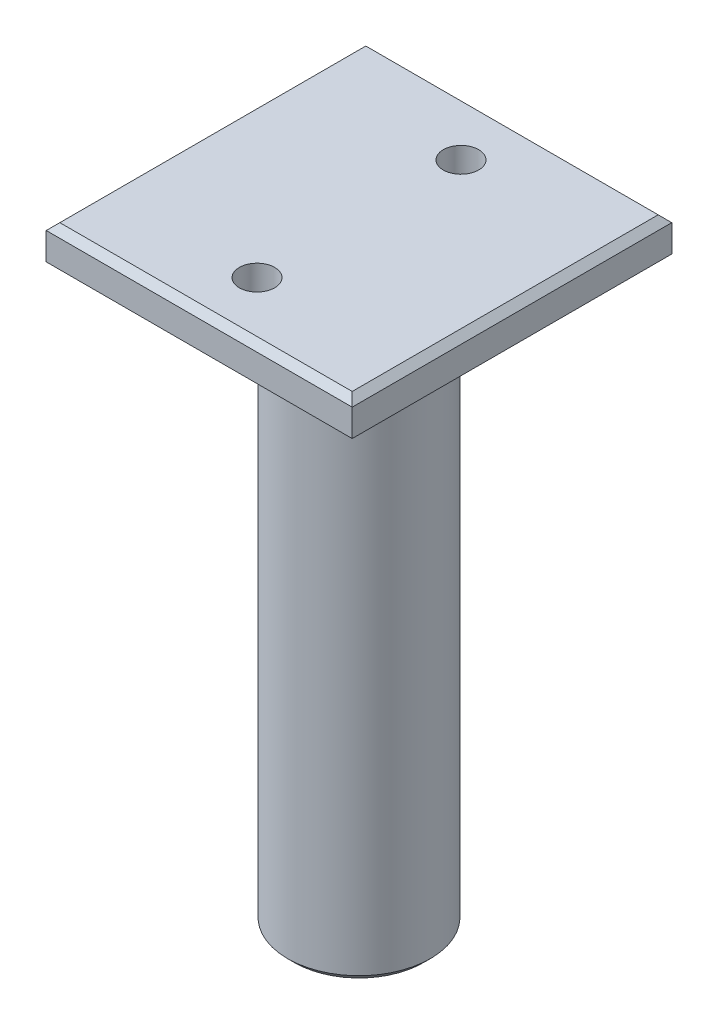
ISO-10303-21;
HEADER;
FILE_DESCRIPTION(('STEP AP214'),'2;1');
FILE_NAME('part.step','',(''),(''),'','','');
FILE_SCHEMA(('AUTOMOTIVE_DESIGN { 1 0 10303 214 1 1 1 1 }'));
ENDSEC;
DATA;
#1=APPLICATION_CONTEXT('core data for automotive mechanical design processes');
#2=APPLICATION_PROTOCOL_DEFINITION('international standard','automotive_design',2000,#1);
#3=PRODUCT_CONTEXT('',#1,'mechanical');
#4=PRODUCT('Part','Part','',(#3));
#5=PRODUCT_RELATED_PRODUCT_CATEGORY('part','',(#4));
#6=PRODUCT_DEFINITION_FORMATION('','',#4);
#7=PRODUCT_DEFINITION_CONTEXT('part definition',#1,'design');
#8=PRODUCT_DEFINITION('design','',#6,#7);
#9=PRODUCT_DEFINITION_SHAPE('','',#8);
#10=(LENGTH_UNIT() NAMED_UNIT(*) SI_UNIT(.MILLI.,.METRE.));
#11=(NAMED_UNIT(*) PLANE_ANGLE_UNIT() SI_UNIT($,.RADIAN.));
#12=(NAMED_UNIT(*) SI_UNIT($,.STERADIAN.) SOLID_ANGLE_UNIT());
#13=UNCERTAINTY_MEASURE_WITH_UNIT(LENGTH_MEASURE(1.E-05),#10,'distance_accuracy_value','');
#14=(GEOMETRIC_REPRESENTATION_CONTEXT(3) GLOBAL_UNCERTAINTY_ASSIGNED_CONTEXT((#13)) GLOBAL_UNIT_ASSIGNED_CONTEXT((#10,
#11,#12)) REPRESENTATION_CONTEXT('',''));
#15=CARTESIAN_POINT('',(0.,0.,0.));
#16=DIRECTION('',(0.,0.,1.));
#17=DIRECTION('',(1.,0.,0.));
#18=AXIS2_PLACEMENT_3D('',#15,#16,#17);
#19=CARTESIAN_POINT('',(0.,0.,0.));
#20=DIRECTION('',(0.,-1.,0.));
#21=DIRECTION('',(0.,0.,-1.));
#22=AXIS2_PLACEMENT_3D('',#19,#20,#21);
#23=PLANE('',#22);
#24=CARTESIAN_POINT('',(0.,0.,15.));
#25=DIRECTION('',(0.,1.,0.));
#26=DIRECTION('',(0.,0.,1.));
#27=AXIS2_PLACEMENT_3D('',#24,#25,#26);
#28=CIRCLE('',#27,2.6);
#29=CARTESIAN_POINT('',(0.,0.,17.6));
#30=VERTEX_POINT('',#29);
#31=EDGE_CURVE('E145',#30,#30,#28,.T.);
#32=ORIENTED_EDGE('',*,*,#31,.F.);
#33=EDGE_LOOP('',(#32));
#34=FACE_BOUND('',#33,.T.);
#35=CARTESIAN_POINT('',(0.,0.,-15.));
#36=DIRECTION('',(0.,1.,0.));
#37=DIRECTION('',(0.,0.,1.));
#38=AXIS2_PLACEMENT_3D('',#35,#36,#37);
#39=CIRCLE('',#38,2.6);
#40=CARTESIAN_POINT('',(0.,0.,-12.4));
#41=VERTEX_POINT('',#40);
#42=EDGE_CURVE('E343',#41,#41,#39,.T.);
#43=ORIENTED_EDGE('',*,*,#42,.F.);
#44=EDGE_LOOP('',(#43));
#45=FACE_BOUND('',#44,.T.);
#46=DIRECTION('',(0.,0.,-1.));
#47=VECTOR('',#46,1.);
#48=CARTESIAN_POINT('',(21.5,0.,0.));
#49=LINE('',#48,#47);
#50=CARTESIAN_POINT('',(21.5,0.,22.5));
#51=VERTEX_POINT('',#50);
#52=CARTESIAN_POINT('',(21.5,0.,-22.5));
#53=VERTEX_POINT('',#52);
#54=EDGE_CURVE('E130',#51,#53,#49,.T.);
#55=ORIENTED_EDGE('',*,*,#54,.T.);
#56=DIRECTION('',(-1.,0.,0.));
#57=VECTOR('',#56,1.);
#58=CARTESIAN_POINT('',(-22.5,0.,-22.5));
#59=LINE('',#58,#57);
#60=CARTESIAN_POINT('',(-21.5,0.,-22.5));
#61=VERTEX_POINT('',#60);
#62=EDGE_CURVE('E135',#53,#61,#59,.T.);
#63=ORIENTED_EDGE('',*,*,#62,.T.);
#64=DIRECTION('',(0.,0.,1.));
#65=VECTOR('',#64,1.);
#66=CARTESIAN_POINT('',(-21.5,0.,23.5));
#67=LINE('',#66,#65);
#68=CARTESIAN_POINT('',(-21.5,0.,22.5));
#69=VERTEX_POINT('',#68);
#70=EDGE_CURVE('E133',#61,#69,#67,.T.);
#71=ORIENTED_EDGE('',*,*,#70,.T.);
#72=DIRECTION('',(1.,0.,0.));
#73=VECTOR('',#72,1.);
#74=CARTESIAN_POINT('',(0.,0.,22.5));
#75=LINE('',#74,#73);
#76=EDGE_CURVE('E128',#69,#51,#75,.T.);
#77=ORIENTED_EDGE('',*,*,#76,.T.);
#78=EDGE_LOOP('',(#55,#63,#71,#77));
#79=FACE_BOUND('',#78,.T.);
#80=ADVANCED_FACE('F40',(#34,#45,#79),#23,.F.);
#81=CARTESIAN_POINT('',(0.,-90.,0.));
#82=DIRECTION('',(0.,1.,0.));
#83=DIRECTION('',(0.,0.,1.));
#84=AXIS2_PLACEMENT_3D('',#81,#82,#83);
#85=PLANE('',#84);
#86=CARTESIAN_POINT('',(0.,-90.,0.));
#87=DIRECTION('',(0.,-1.,0.));
#88=DIRECTION('',(0.,0.,-1.));
#89=AXIS2_PLACEMENT_3D('',#86,#87,#88);
#90=CIRCLE('',#89,4.59999999999999);
#91=CARTESIAN_POINT('',(0.,-90.,-4.59999999999999));
#92=VERTEX_POINT('',#91);
#93=EDGE_CURVE('E125',#92,#92,#90,.T.);
#94=ORIENTED_EDGE('',*,*,#93,.F.);
#95=EDGE_LOOP('',(#94));
#96=FACE_BOUND('',#95,.T.);
#97=CARTESIAN_POINT('',(0.,-90.,0.));
#98=DIRECTION('',(0.,1.,0.));
#99=DIRECTION('',(0.,0.,1.));
#100=AXIS2_PLACEMENT_3D('',#97,#98,#99);
#101=CIRCLE('',#100,9.49999999999999);
#102=CARTESIAN_POINT('',(0.,-90.,9.49999999999999));
#103=VERTEX_POINT('',#102);
#104=EDGE_CURVE('E131',#103,#103,#101,.F.);
#105=ORIENTED_EDGE('',*,*,#104,.T.);
#106=EDGE_LOOP('',(#105));
#107=FACE_BOUND('',#106,.T.);
#108=ADVANCED_FACE('F181',(#96,#107),#85,.F.);
#109=CARTESIAN_POINT('',(0.,-5.,0.));
#110=DIRECTION('',(0.,-1.,0.));
#111=DIRECTION('',(0.,0.,-1.));
#112=AXIS2_PLACEMENT_3D('',#109,#110,#111);
#113=PLANE('',#112);
#114=CARTESIAN_POINT('',(0.,-5.,15.));
#115=DIRECTION('',(0.,-1.,0.));
#116=DIRECTION('',(0.,0.,-1.));
#117=AXIS2_PLACEMENT_3D('',#114,#115,#116);
#118=CIRCLE('',#117,2.6);
#119=CARTESIAN_POINT('',(0.,-4.99999999999999,17.6));
#120=VERTEX_POINT('',#119);
#121=EDGE_CURVE('E340',#120,#120,#118,.F.);
#122=ORIENTED_EDGE('',*,*,#121,.T.);
#123=EDGE_LOOP('',(#122));
#124=FACE_BOUND('',#123,.T.);
#125=CARTESIAN_POINT('',(0.,-5.,-15.));
#126=DIRECTION('',(0.,-1.,0.));
#127=DIRECTION('',(0.,0.,-1.));
#128=AXIS2_PLACEMENT_3D('',#125,#126,#127);
#129=CIRCLE('',#128,2.6);
#130=CARTESIAN_POINT('',(0.,-4.99999999999999,-12.4));
#131=VERTEX_POINT('',#130);
#132=EDGE_CURVE('E347',#131,#131,#129,.F.);
#133=ORIENTED_EDGE('',*,*,#132,.T.);
#134=EDGE_LOOP('',(#133));
#135=FACE_BOUND('',#134,.T.);
#136=DIRECTION('',(-1.,0.,0.));
#137=VECTOR('',#136,1.);
#138=CARTESIAN_POINT('',(22.5,-5.,-23.5));
#139=LINE('',#138,#137);
#140=CARTESIAN_POINT('',(22.5,-5.,-23.5));
#141=VERTEX_POINT('',#140);
#142=CARTESIAN_POINT('',(-22.5,-5.,-23.5));
#143=VERTEX_POINT('',#142);
#144=EDGE_CURVE('E99',#141,#143,#139,.T.);
#145=ORIENTED_EDGE('',*,*,#144,.F.);
#146=DIRECTION('',(0.,0.,1.));
#147=VECTOR('',#146,1.);
#148=CARTESIAN_POINT('',(22.5,-5.,-28.5));
#149=LINE('',#148,#147);
#150=CARTESIAN_POINT('',(22.5,-5.,23.5));
#151=VERTEX_POINT('',#150);
#152=EDGE_CURVE('E120',#141,#151,#149,.T.);
#153=ORIENTED_EDGE('',*,*,#152,.T.);
#154=DIRECTION('',(-1.,0.,0.));
#155=VECTOR('',#154,1.);
#156=CARTESIAN_POINT('',(22.5,-5.,23.5));
#157=LINE('',#156,#155);
#158=CARTESIAN_POINT('',(-22.5,-5.,23.5));
#159=VERTEX_POINT('',#158);
#160=EDGE_CURVE('E101',#151,#159,#157,.T.);
#161=ORIENTED_EDGE('',*,*,#160,.T.);
#162=DIRECTION('',(0.,0.,1.));
#163=VECTOR('',#162,1.);
#164=CARTESIAN_POINT('',(-22.5,-5.,-28.5));
#165=LINE('',#164,#163);
#166=EDGE_CURVE('E95',#143,#159,#165,.T.);
#167=ORIENTED_EDGE('',*,*,#166,.F.);
#168=EDGE_LOOP('',(#145,#153,#161,#167));
#169=FACE_BOUND('',#168,.T.);
#170=CARTESIAN_POINT('',(0.,-5.,0.));
#171=DIRECTION('',(0.,1.,0.));
#172=DIRECTION('',(0.,0.,1.));
#173=AXIS2_PLACEMENT_3D('',#170,#171,#172);
#174=CIRCLE('',#173,10.5);
#175=CARTESIAN_POINT('',(0.,-5.,10.5));
#176=VERTEX_POINT('',#175);
#177=EDGE_CURVE('E173',#176,#176,#174,.F.);
#178=ORIENTED_EDGE('',*,*,#177,.F.);
#179=EDGE_LOOP('',(#178));
#180=FACE_BOUND('',#179,.T.);
#181=ADVANCED_FACE('F97',(#124,#135,#169,#180),#113,.T.);
#182=CARTESIAN_POINT('',(0.,-90.,0.));
#183=DIRECTION('',(0.,1.,0.));
#184=DIRECTION('',(0.,0.,1.));
#185=AXIS2_PLACEMENT_3D('',#182,#183,#184);
#186=CYLINDRICAL_SURFACE('',#185,10.5);
#187=CARTESIAN_POINT('',(0.,-89.,0.));
#188=DIRECTION('',(0.,1.,0.));
#189=DIRECTION('',(0.,0.,1.));
#190=AXIS2_PLACEMENT_3D('',#187,#188,#189);
#191=CIRCLE('',#190,10.5);
#192=CARTESIAN_POINT('',(0.,-89.,10.5));
#193=VERTEX_POINT('',#192);
#194=EDGE_CURVE('E176',#193,#193,#191,.T.);
#195=ORIENTED_EDGE('',*,*,#194,.T.);
#196=EDGE_LOOP('',(#195));
#197=FACE_BOUND('',#196,.T.);
#198=ORIENTED_EDGE('',*,*,#177,.T.);
#199=EDGE_LOOP('',(#198));
#200=FACE_BOUND('',#199,.T.);
#201=ADVANCED_FACE('F187',(#197,#200),#186,.T.);
#202=CARTESIAN_POINT('',(0.,-89.,0.));
#203=DIRECTION('',(0.,1.,0.));
#204=DIRECTION('',(0.,0.,1.));
#205=AXIS2_PLACEMENT_3D('',#202,#203,#204);
#206=CONICAL_SURFACE('',#205,10.5,0.785398163397444);
#207=ORIENTED_EDGE('',*,*,#104,.F.);
#208=EDGE_LOOP('',(#207));
#209=FACE_BOUND('',#208,.T.);
#210=ORIENTED_EDGE('',*,*,#194,.F.);
#211=EDGE_LOOP('',(#210));
#212=FACE_BOUND('',#211,.T.);
#213=ADVANCED_FACE('F183',(#209,#212),#206,.T.);
#214=CARTESIAN_POINT('',(0.,-90.,0.));
#215=DIRECTION('',(0.,-1.,0.));
#216=DIRECTION('',(0.,0.,-1.));
#217=AXIS2_PLACEMENT_3D('',#214,#215,#216);
#218=CYLINDRICAL_SURFACE('',#217,4.59999999999998);
#219=CARTESIAN_POINT('',(0.,-4.99999999999999,0.));
#220=DIRECTION('',(0.,-1.,0.));
#221=DIRECTION('',(0.,0.,-1.));
#222=AXIS2_PLACEMENT_3D('',#219,#220,#221);
#223=CIRCLE('',#222,4.59999999999998);
#224=CARTESIAN_POINT('',(0.,-4.99999999999999,-4.59999999999998));
#225=VERTEX_POINT('',#224);
#226=EDGE_CURVE('E170',#225,#225,#223,.T.);
#227=ORIENTED_EDGE('',*,*,#226,.F.);
#228=EDGE_LOOP('',(#227));
#229=FACE_BOUND('',#228,.T.);
#230=ORIENTED_EDGE('',*,*,#93,.T.);
#231=EDGE_LOOP('',(#230));
#232=FACE_BOUND('',#231,.T.);
#233=ADVANCED_FACE('F186',(#229,#232),#218,.F.);
#234=ORIENTED_EDGE('',*,*,#226,.T.);
#235=EDGE_LOOP('',(#234));
#236=FACE_BOUND('',#235,.T.);
#237=ADVANCED_FACE('F198',(#236),#113,.T.);
#238=CARTESIAN_POINT('',(22.5,-77.6223106214612,-23.5));
#239=DIRECTION('',(0.,0.,-1.));
#240=DIRECTION('',(-1.,0.,0.));
#241=AXIS2_PLACEMENT_3D('',#238,#239,#240);
#242=PLANE('',#241);
#243=DIRECTION('',(0.,1.,0.));
#244=VECTOR('',#243,1.);
#245=CARTESIAN_POINT('',(-22.5,-77.6223106214612,-23.5));
#246=LINE('',#245,#244);
#247=CARTESIAN_POINT('',(-22.5,-1.,-23.5));
#248=VERTEX_POINT('',#247);
#249=EDGE_CURVE('E112',#143,#248,#246,.T.);
#250=ORIENTED_EDGE('',*,*,#249,.T.);
#251=DIRECTION('',(1.,0.,0.));
#252=VECTOR('',#251,1.);
#253=CARTESIAN_POINT('',(22.5,-1.,-23.5));
#254=LINE('',#253,#252);
#255=CARTESIAN_POINT('',(22.5,-1.,-23.5));
#256=VERTEX_POINT('',#255);
#257=EDGE_CURVE('E138',#248,#256,#254,.T.);
#258=ORIENTED_EDGE('',*,*,#257,.T.);
#259=DIRECTION('',(0.,1.,0.));
#260=VECTOR('',#259,1.);
#261=CARTESIAN_POINT('',(22.5,-77.6223106214612,-23.5));
#262=LINE('',#261,#260);
#263=EDGE_CURVE('E114',#141,#256,#262,.T.);
#264=ORIENTED_EDGE('',*,*,#263,.F.);
#265=ORIENTED_EDGE('',*,*,#144,.T.);
#266=EDGE_LOOP('',(#250,#258,#264,#265));
#267=FACE_BOUND('',#266,.T.);
#268=ADVANCED_FACE('F110',(#267),#242,.T.);
#269=CARTESIAN_POINT('',(-22.5,-77.6223106214612,-28.5));
#270=DIRECTION('',(-1.,0.,0.));
#271=DIRECTION('',(0.,0.,1.));
#272=AXIS2_PLACEMENT_3D('',#269,#270,#271);
#273=PLANE('',#272);
#274=DIRECTION('',(0.,1.,0.));
#275=VECTOR('',#274,1.);
#276=CARTESIAN_POINT('',(-22.5,-77.6223106214612,23.5));
#277=LINE('',#276,#275);
#278=CARTESIAN_POINT('',(-22.5,-1.,23.5));
#279=VERTEX_POINT('',#278);
#280=EDGE_CURVE('E104',#159,#279,#277,.T.);
#281=ORIENTED_EDGE('',*,*,#280,.T.);
#282=DIRECTION('',(0.,0.,-1.));
#283=VECTOR('',#282,1.);
#284=CARTESIAN_POINT('',(-22.5,-1.,-23.5));
#285=LINE('',#284,#283);
#286=EDGE_CURVE('E118',#279,#248,#285,.T.);
#287=ORIENTED_EDGE('',*,*,#286,.T.);
#288=ORIENTED_EDGE('',*,*,#249,.F.);
#289=ORIENTED_EDGE('',*,*,#166,.T.);
#290=EDGE_LOOP('',(#281,#287,#288,#289));
#291=FACE_BOUND('',#290,.T.);
#292=ADVANCED_FACE('F116',(#291),#273,.T.);
#293=CARTESIAN_POINT('',(22.5,-77.6223106214612,-28.5));
#294=DIRECTION('',(-1.,0.,0.));
#295=DIRECTION('',(0.,0.,1.));
#296=AXIS2_PLACEMENT_3D('',#293,#294,#295);
#297=PLANE('',#296);
#298=ORIENTED_EDGE('',*,*,#263,.T.);
#299=DIRECTION('',(0.,0.,1.));
#300=VECTOR('',#299,1.);
#301=CARTESIAN_POINT('',(22.5,-1.,-28.5));
#302=LINE('',#301,#300);
#303=CARTESIAN_POINT('',(22.5,-1.,23.5));
#304=VERTEX_POINT('',#303);
#305=EDGE_CURVE('E49',#256,#304,#302,.T.);
#306=ORIENTED_EDGE('',*,*,#305,.T.);
#307=DIRECTION('',(0.,1.,0.));
#308=VECTOR('',#307,1.);
#309=CARTESIAN_POINT('',(22.5,-77.6223106214612,23.5));
#310=LINE('',#309,#308);
#311=EDGE_CURVE('E105',#151,#304,#310,.T.);
#312=ORIENTED_EDGE('',*,*,#311,.F.);
#313=ORIENTED_EDGE('',*,*,#152,.F.);
#314=EDGE_LOOP('',(#298,#306,#312,#313));
#315=FACE_BOUND('',#314,.T.);
#316=ADVANCED_FACE('F164',(#315),#297,.F.);
#317=CARTESIAN_POINT('',(22.5,-77.6223106214612,23.5));
#318=DIRECTION('',(0.,0.,-1.));
#319=DIRECTION('',(-1.,0.,0.));
#320=AXIS2_PLACEMENT_3D('',#317,#318,#319);
#321=PLANE('',#320);
#322=ORIENTED_EDGE('',*,*,#311,.T.);
#323=DIRECTION('',(-1.,0.,0.));
#324=VECTOR('',#323,1.);
#325=CARTESIAN_POINT('',(22.5,-1.,23.5));
#326=LINE('',#325,#324);
#327=EDGE_CURVE('E13',#304,#279,#326,.T.);
#328=ORIENTED_EDGE('',*,*,#327,.T.);
#329=ORIENTED_EDGE('',*,*,#280,.F.);
#330=ORIENTED_EDGE('',*,*,#160,.F.);
#331=EDGE_LOOP('',(#322,#328,#329,#330));
#332=FACE_BOUND('',#331,.T.);
#333=ADVANCED_FACE('F220',(#332),#321,.F.);
#334=CARTESIAN_POINT('',(22.5,-1.,23.5));
#335=DIRECTION('',(0.,-0.707106781186547,-0.707106781186547));
#336=DIRECTION('',(-1.,0.,0.));
#337=AXIS2_PLACEMENT_3D('',#334,#335,#336);
#338=PLANE('',#337);
#339=DIRECTION('',(0.577350269189626,0.577350269189626,-0.577350269189626));
#340=VECTOR('',#339,1.);
#341=CARTESIAN_POINT('',(-7.5,14.,8.5));
#342=LINE('',#341,#340);
#343=EDGE_CURVE('E146',#279,#69,#342,.T.);
#344=ORIENTED_EDGE('',*,*,#343,.F.);
#345=ORIENTED_EDGE('',*,*,#327,.F.);
#346=DIRECTION('',(-0.577350269189626,0.577350269189626,-0.577350269189626));
#347=VECTOR('',#346,1.);
#348=CARTESIAN_POINT('',(22.5,-1.,23.5));
#349=LINE('',#348,#347);
#350=EDGE_CURVE('E44',#51,#304,#349,.F.);
#351=ORIENTED_EDGE('',*,*,#350,.F.);
#352=ORIENTED_EDGE('',*,*,#76,.F.);
#353=EDGE_LOOP('',(#344,#345,#351,#352));
#354=FACE_BOUND('',#353,.T.);
#355=ADVANCED_FACE('F42',(#354),#338,.F.);
#356=CARTESIAN_POINT('',(22.5,-1.,-28.5));
#357=DIRECTION('',(-0.707106781186547,-0.707106781186547,0.));
#358=DIRECTION('',(0.,0.,1.));
#359=AXIS2_PLACEMENT_3D('',#356,#357,#358);
#360=PLANE('',#359);
#361=ORIENTED_EDGE('',*,*,#350,.T.);
#362=ORIENTED_EDGE('',*,*,#305,.F.);
#363=DIRECTION('',(0.577350269189626,-0.577350269189626,-0.577350269189626));
#364=VECTOR('',#363,1.);
#365=CARTESIAN_POINT('',(24.1666666666667,-2.66666666666667,-25.1666666666667));
#366=LINE('',#365,#364);
#367=EDGE_CURVE('E144',#53,#256,#366,.T.);
#368=ORIENTED_EDGE('',*,*,#367,.F.);
#369=ORIENTED_EDGE('',*,*,#54,.F.);
#370=EDGE_LOOP('',(#361,#362,#368,#369));
#371=FACE_BOUND('',#370,.T.);
#372=ADVANCED_FACE('F155',(#371),#360,.F.);
#373=CARTESIAN_POINT('',(-21.5,0.,0.));
#374=DIRECTION('',(-0.707106781186547,0.707106781186547,0.));
#375=DIRECTION('',(0.,0.,-1.));
#376=AXIS2_PLACEMENT_3D('',#373,#374,#375);
#377=PLANE('',#376);
#378=ORIENTED_EDGE('',*,*,#343,.T.);
#379=ORIENTED_EDGE('',*,*,#70,.F.);
#380=DIRECTION('',(-0.577350269189626,-0.577350269189626,-0.577350269189626));
#381=VECTOR('',#380,1.);
#382=CARTESIAN_POINT('',(-14.,7.5,-15.));
#383=LINE('',#382,#381);
#384=EDGE_CURVE('E142',#248,#61,#383,.F.);
#385=ORIENTED_EDGE('',*,*,#384,.F.);
#386=ORIENTED_EDGE('',*,*,#286,.F.);
#387=EDGE_LOOP('',(#378,#379,#385,#386));
#388=FACE_BOUND('',#387,.T.);
#389=ADVANCED_FACE('F160',(#388),#377,.T.);
#390=CARTESIAN_POINT('',(0.,0.,-22.5));
#391=DIRECTION('',(0.,0.707106781186547,-0.707106781186547));
#392=DIRECTION('',(1.,0.,0.));
#393=AXIS2_PLACEMENT_3D('',#390,#391,#392);
#394=PLANE('',#393);
#395=ORIENTED_EDGE('',*,*,#367,.T.);
#396=ORIENTED_EDGE('',*,*,#257,.F.);
#397=ORIENTED_EDGE('',*,*,#384,.T.);
#398=ORIENTED_EDGE('',*,*,#62,.F.);
#399=EDGE_LOOP('',(#395,#396,#397,#398));
#400=FACE_BOUND('',#399,.T.);
#401=ADVANCED_FACE('F163',(#400),#394,.T.);
#402=CARTESIAN_POINT('',(0.,-90.001,-15.));
#403=DIRECTION('',(0.,1.,0.));
#404=DIRECTION('',(0.,0.,1.));
#405=AXIS2_PLACEMENT_3D('',#402,#403,#404);
#406=CYLINDRICAL_SURFACE('',#405,2.6);
#407=CARTESIAN_POINT('',(0.,-4.99999999999999,-12.4));
#408=CARTESIAN_POINT('',(0.,-4.94791666666666,-12.4));
#409=CARTESIAN_POINT('',(0.,-4.89583333333333,-12.4));
#410=CARTESIAN_POINT('',(0.,-4.79166666666666,-12.4));
#411=CARTESIAN_POINT('',(0.,-4.73958333333333,-12.4));
#412=CARTESIAN_POINT('',(0.,-4.63541666666666,-12.4));
#413=CARTESIAN_POINT('',(0.,-4.58333333333332,-12.4));
#414=CARTESIAN_POINT('',(0.,-4.47916666666665,-12.4));
#415=CARTESIAN_POINT('',(0.,-4.42708333333332,-12.4));
#416=CARTESIAN_POINT('',(0.,-4.32291666666666,-12.4));
#417=CARTESIAN_POINT('',(0.,-4.27083333333333,-12.4));
#418=CARTESIAN_POINT('',(0.,-4.16666666666666,-12.4));
#419=CARTESIAN_POINT('',(0.,-4.11458333333333,-12.4));
#420=CARTESIAN_POINT('',(0.,-4.01041666666666,-12.4));
#421=CARTESIAN_POINT('',(0.,-3.95833333333333,-12.4));
#422=CARTESIAN_POINT('',(0.,-3.85416666666666,-12.4));
#423=CARTESIAN_POINT('',(0.,-3.80208333333333,-12.4));
#424=CARTESIAN_POINT('',(0.,-3.69791666666666,-12.4));
#425=CARTESIAN_POINT('',(0.,-3.64583333333333,-12.4));
#426=CARTESIAN_POINT('',(0.,-3.54166666666666,-12.4));
#427=CARTESIAN_POINT('',(0.,-3.48958333333333,-12.4));
#428=CARTESIAN_POINT('',(0.,-3.38541666666666,-12.4));
#429=CARTESIAN_POINT('',(0.,-3.33333333333333,-12.4));
#430=CARTESIAN_POINT('',(0.,-3.22916666666667,-12.4));
#431=CARTESIAN_POINT('',(0.,-3.17708333333334,-12.4));
#432=CARTESIAN_POINT('',(0.,-3.07291666666667,-12.4));
#433=CARTESIAN_POINT('',(0.,-3.02083333333334,-12.4));
#434=CARTESIAN_POINT('',(0.,-2.91666666666667,-12.4));
#435=CARTESIAN_POINT('',(0.,-2.86458333333333,-12.4));
#436=CARTESIAN_POINT('',(0.,-2.76041666666666,-12.4));
#437=CARTESIAN_POINT('',(0.,-2.70833333333333,-12.4));
#438=CARTESIAN_POINT('',(0.,-2.60416666666667,-12.4));
#439=CARTESIAN_POINT('',(0.,-2.55208333333333,-12.4));
#440=CARTESIAN_POINT('',(0.,-2.44791666666667,-12.4));
#441=CARTESIAN_POINT('',(0.,-2.39583333333334,-12.4));
#442=CARTESIAN_POINT('',(0.,-2.29166666666667,-12.4));
#443=CARTESIAN_POINT('',(0.,-2.23958333333334,-12.4));
#444=CARTESIAN_POINT('',(0.,-2.13541666666667,-12.4));
#445=CARTESIAN_POINT('',(0.,-2.08333333333334,-12.4));
#446=CARTESIAN_POINT('',(0.,-1.97916666666667,-12.4));
#447=CARTESIAN_POINT('',(0.,-1.92708333333333,-12.4));
#448=CARTESIAN_POINT('',(0.,-1.82291666666667,-12.4));
#449=CARTESIAN_POINT('',(0.,-1.77083333333334,-12.4));
#450=CARTESIAN_POINT('',(0.,-1.66666666666667,-12.4));
#451=CARTESIAN_POINT('',(0.,-1.61458333333334,-12.4));
#452=CARTESIAN_POINT('',(0.,-1.51041666666668,-12.4));
#453=CARTESIAN_POINT('',(0.,-1.45833333333334,-12.4));
#454=CARTESIAN_POINT('',(0.,-1.35416666666668,-12.4));
#455=CARTESIAN_POINT('',(0.,-1.30208333333335,-12.4));
#456=CARTESIAN_POINT('',(0.,-1.19791666666668,-12.4));
#457=CARTESIAN_POINT('',(0.,-1.14583333333334,-12.4));
#458=CARTESIAN_POINT('',(0.,-1.04166666666667,-12.4));
#459=CARTESIAN_POINT('',(0.,-0.98958333333334,-12.4));
#460=CARTESIAN_POINT('',(0.,-0.885416666666676,-12.4));
#461=CARTESIAN_POINT('',(0.,-0.833333333333343,-12.4));
#462=CARTESIAN_POINT('',(0.,-0.729166666666679,-12.4));
#463=CARTESIAN_POINT('',(0.,-0.677083333333347,-12.4));
#464=CARTESIAN_POINT('',(0.,-0.572916666666682,-12.4));
#465=CARTESIAN_POINT('',(0.,-0.52083333333335,-12.4));
#466=CARTESIAN_POINT('',(0.,-0.416666666666681,-12.4));
#467=CARTESIAN_POINT('',(0.,-0.364583333333344,-12.4));
#468=CARTESIAN_POINT('',(0.,-0.260416666666675,-12.4));
#469=CARTESIAN_POINT('',(0.,-0.208333333333343,-12.4));
#470=CARTESIAN_POINT('',(0.,-0.104166666666678,-12.4));
#471=CARTESIAN_POINT('',(0.,-0.0520833333333461,-12.4));
#472=CARTESIAN_POINT('',(0.,0.,-12.4));
#473=B_SPLINE_CURVE_WITH_KNOTS('',3,(#407,#408,#409,#410,#411,#412,#413,#414,#415,#416,#417,
#418,#419,#420,#421,#422,#423,#424,#425,#426,#427,#428,#429,#430,#431,#432,#433,#434,#435,#436,
#437,#438,#439,#440,#441,#442,#443,#444,#445,#446,#447,#448,#449,#450,#451,#452,#453,#454,#455,
#456,#457,#458,#459,#460,#461,#462,#463,#464,#465,#466,#467,#468,#469,#470,#471,#472),
.UNSPECIFIED.,.F.,.F.,(4,2,2,2,2,2,2,2,2,2,2,2,2,2,2,2,2,2,2,2,2,2,2,2,2,2,2,2,2,2,2,2,4),(0.,
0.156249999999997,0.312499999999993,0.468750000000004,0.625000000000001,0.781249999999997,
0.937499999999994,1.09374999999999,1.25,1.40625,1.56249999999999,1.71874999999999,
1.87499999999999,2.03124999999998,2.1875,2.34374999999999,2.49999999999999,2.65624999999998,
2.81249999999998,2.96874999999999,3.12499999999999,3.28124999999999,3.43749999999998,
3.59374999999998,3.74999999999998,3.90624999999999,4.06249999999998,4.21874999999998,
4.37499999999998,4.53124999999997,4.68749999999998,4.84374999999998,4.99999999999998),.UNSPECIFIED.);
#474=EDGE_CURVE('BSEAM225',#131,#41,#473,.T.);
#475=ORIENTED_EDGE('',*,*,#132,.F.);
#476=ORIENTED_EDGE('',*,*,#42,.T.);
#477=ORIENTED_EDGE('',*,*,#474,.T.);
#478=ORIENTED_EDGE('',*,*,#474,.F.);
#479=EDGE_LOOP('',(#475,#477,#476,#478));
#480=FACE_BOUND('',#479,.T.);
#481=ADVANCED_FACE('F225',(#480),#406,.F.);
#482=CARTESIAN_POINT('',(0.,-90.001,15.));
#483=DIRECTION('',(0.,1.,0.));
#484=DIRECTION('',(0.,0.,1.));
#485=AXIS2_PLACEMENT_3D('',#482,#483,#484);
#486=CYLINDRICAL_SURFACE('',#485,2.6);
#487=CARTESIAN_POINT('',(0.,-4.99999999999999,17.6));
#488=CARTESIAN_POINT('',(0.,-4.94791666666666,17.6));
#489=CARTESIAN_POINT('',(0.,-4.89583333333333,17.6));
#490=CARTESIAN_POINT('',(0.,-4.79166666666666,17.6));
#491=CARTESIAN_POINT('',(0.,-4.73958333333333,17.6));
#492=CARTESIAN_POINT('',(0.,-4.63541666666666,17.6));
#493=CARTESIAN_POINT('',(0.,-4.58333333333332,17.6));
#494=CARTESIAN_POINT('',(0.,-4.47916666666665,17.6));
#495=CARTESIAN_POINT('',(0.,-4.42708333333332,17.6));
#496=CARTESIAN_POINT('',(0.,-4.32291666666666,17.6));
#497=CARTESIAN_POINT('',(0.,-4.27083333333333,17.6));
#498=CARTESIAN_POINT('',(0.,-4.16666666666666,17.6));
#499=CARTESIAN_POINT('',(0.,-4.11458333333333,17.6));
#500=CARTESIAN_POINT('',(0.,-4.01041666666666,17.6));
#501=CARTESIAN_POINT('',(0.,-3.95833333333333,17.6));
#502=CARTESIAN_POINT('',(0.,-3.85416666666666,17.6));
#503=CARTESIAN_POINT('',(0.,-3.80208333333333,17.6));
#504=CARTESIAN_POINT('',(0.,-3.69791666666666,17.6));
#505=CARTESIAN_POINT('',(0.,-3.64583333333333,17.6));
#506=CARTESIAN_POINT('',(0.,-3.54166666666666,17.6));
#507=CARTESIAN_POINT('',(0.,-3.48958333333333,17.6));
#508=CARTESIAN_POINT('',(0.,-3.38541666666666,17.6));
#509=CARTESIAN_POINT('',(0.,-3.33333333333333,17.6));
#510=CARTESIAN_POINT('',(0.,-3.22916666666667,17.6));
#511=CARTESIAN_POINT('',(0.,-3.17708333333334,17.6));
#512=CARTESIAN_POINT('',(0.,-3.07291666666667,17.6));
#513=CARTESIAN_POINT('',(0.,-3.02083333333334,17.6));
#514=CARTESIAN_POINT('',(0.,-2.91666666666667,17.6));
#515=CARTESIAN_POINT('',(0.,-2.86458333333333,17.6));
#516=CARTESIAN_POINT('',(0.,-2.76041666666666,17.6));
#517=CARTESIAN_POINT('',(0.,-2.70833333333333,17.6));
#518=CARTESIAN_POINT('',(0.,-2.60416666666667,17.6));
#519=CARTESIAN_POINT('',(0.,-2.55208333333333,17.6));
#520=CARTESIAN_POINT('',(0.,-2.44791666666667,17.6));
#521=CARTESIAN_POINT('',(0.,-2.39583333333334,17.6));
#522=CARTESIAN_POINT('',(0.,-2.29166666666667,17.6));
#523=CARTESIAN_POINT('',(0.,-2.23958333333334,17.6));
#524=CARTESIAN_POINT('',(0.,-2.13541666666667,17.6));
#525=CARTESIAN_POINT('',(0.,-2.08333333333334,17.6));
#526=CARTESIAN_POINT('',(0.,-1.97916666666667,17.6));
#527=CARTESIAN_POINT('',(0.,-1.92708333333333,17.6));
#528=CARTESIAN_POINT('',(0.,-1.82291666666667,17.6));
#529=CARTESIAN_POINT('',(0.,-1.77083333333334,17.6));
#530=CARTESIAN_POINT('',(0.,-1.66666666666667,17.6));
#531=CARTESIAN_POINT('',(0.,-1.61458333333334,17.6));
#532=CARTESIAN_POINT('',(0.,-1.51041666666668,17.6));
#533=CARTESIAN_POINT('',(0.,-1.45833333333334,17.6));
#534=CARTESIAN_POINT('',(0.,-1.35416666666668,17.6));
#535=CARTESIAN_POINT('',(0.,-1.30208333333335,17.6));
#536=CARTESIAN_POINT('',(0.,-1.19791666666668,17.6));
#537=CARTESIAN_POINT('',(0.,-1.14583333333334,17.6));
#538=CARTESIAN_POINT('',(0.,-1.04166666666667,17.6));
#539=CARTESIAN_POINT('',(0.,-0.98958333333334,17.6));
#540=CARTESIAN_POINT('',(0.,-0.885416666666676,17.6));
#541=CARTESIAN_POINT('',(0.,-0.833333333333343,17.6));
#542=CARTESIAN_POINT('',(0.,-0.729166666666679,17.6));
#543=CARTESIAN_POINT('',(0.,-0.677083333333347,17.6));
#544=CARTESIAN_POINT('',(0.,-0.572916666666682,17.6));
#545=CARTESIAN_POINT('',(0.,-0.52083333333335,17.6));
#546=CARTESIAN_POINT('',(0.,-0.416666666666681,17.6));
#547=CARTESIAN_POINT('',(0.,-0.364583333333344,17.6));
#548=CARTESIAN_POINT('',(0.,-0.260416666666675,17.6));
#549=CARTESIAN_POINT('',(0.,-0.208333333333343,17.6));
#550=CARTESIAN_POINT('',(0.,-0.104166666666678,17.6));
#551=CARTESIAN_POINT('',(0.,-0.0520833333333461,17.6));
#552=CARTESIAN_POINT('',(0.,0.,17.6));
#553=B_SPLINE_CURVE_WITH_KNOTS('',3,(#487,#488,#489,#490,#491,#492,#493,#494,#495,#496,#497,
#498,#499,#500,#501,#502,#503,#504,#505,#506,#507,#508,#509,#510,#511,#512,#513,#514,#515,#516,
#517,#518,#519,#520,#521,#522,#523,#524,#525,#526,#527,#528,#529,#530,#531,#532,#533,#534,#535,
#536,#537,#538,#539,#540,#541,#542,#543,#544,#545,#546,#547,#548,#549,#550,#551,#552),
.UNSPECIFIED.,.F.,.F.,(4,2,2,2,2,2,2,2,2,2,2,2,2,2,2,2,2,2,2,2,2,2,2,2,2,2,2,2,2,2,2,2,4),(0.,
0.156249999999997,0.312499999999993,0.468750000000004,0.625000000000001,0.781249999999997,
0.937499999999994,1.09374999999999,1.25,1.40625,1.56249999999999,1.71874999999999,
1.87499999999999,2.03124999999998,2.1875,2.34374999999999,2.49999999999999,2.65624999999998,
2.81249999999998,2.96874999999999,3.12499999999999,3.28124999999999,3.43749999999998,
3.59374999999998,3.74999999999998,3.90624999999999,4.06249999999998,4.21874999999998,
4.37499999999998,4.53124999999997,4.68749999999998,4.84374999999998,4.99999999999998),.UNSPECIFIED.);
#554=EDGE_CURVE('BSEAM332',#120,#30,#553,.T.);
#555=ORIENTED_EDGE('',*,*,#121,.F.);
#556=ORIENTED_EDGE('',*,*,#31,.T.);
#557=ORIENTED_EDGE('',*,*,#554,.T.);
#558=ORIENTED_EDGE('',*,*,#554,.F.);
#559=EDGE_LOOP('',(#555,#557,#556,#558));
#560=FACE_BOUND('',#559,.T.);
#561=ADVANCED_FACE('F332',(#560),#486,.F.);
#562=CLOSED_SHELL('',(#80,#108,#181,#201,#213,#233,#237,#268,#292,#316,#333,#355,#372,#389,#401,
#481,#561));
#563=MANIFOLD_SOLID_BREP('B2',#562);
#564=ADVANCED_BREP_SHAPE_REPRESENTATION('',(#18,#563),#14);
#565=SHAPE_DEFINITION_REPRESENTATION(#9,#564);
ENDSEC;
END-ISO-10303-21;
